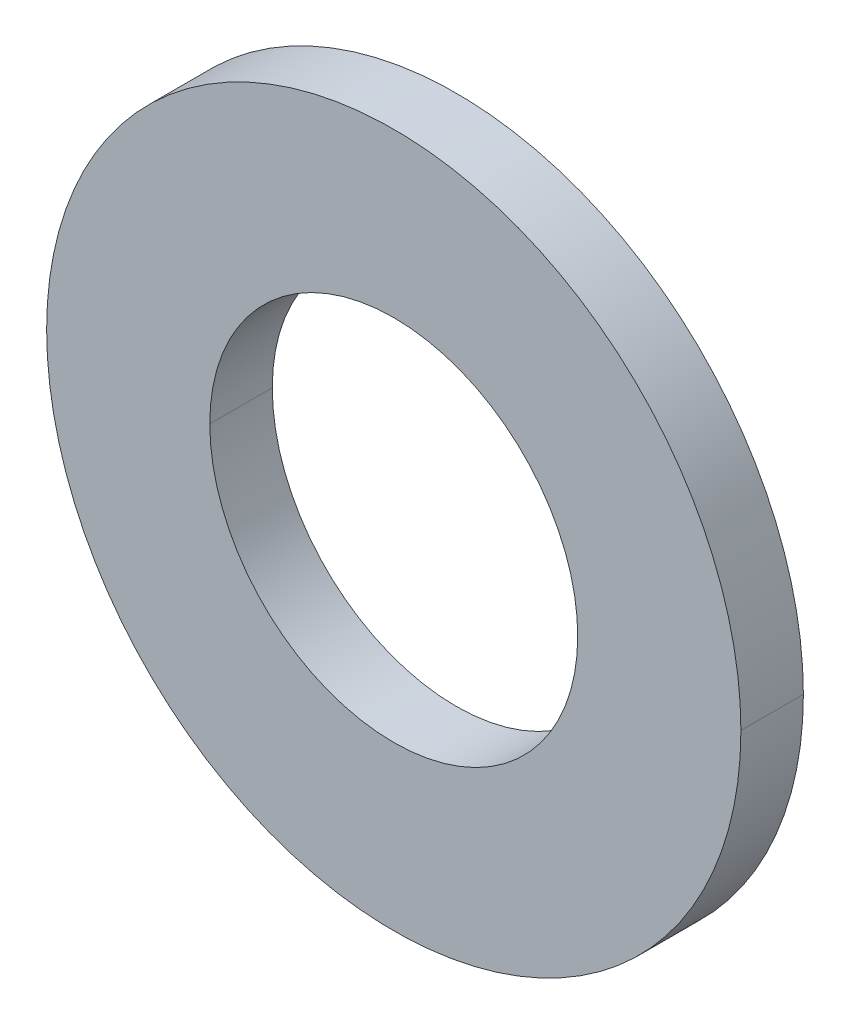
ISO-10303-21;
HEADER;
FILE_DESCRIPTION(('STEP AP214'),'2;1');
FILE_NAME('part.step','',(''),(''),'','','');
FILE_SCHEMA(('AUTOMOTIVE_DESIGN { 1 0 10303 214 1 1 1 1 }'));
ENDSEC;
DATA;
#1=APPLICATION_CONTEXT('core data for automotive mechanical design processes');
#2=APPLICATION_PROTOCOL_DEFINITION('international standard','automotive_design',2000,#1);
#3=PRODUCT_CONTEXT('',#1,'mechanical');
#4=PRODUCT('Part','Part','',(#3));
#5=PRODUCT_RELATED_PRODUCT_CATEGORY('part','',(#4));
#6=PRODUCT_DEFINITION_FORMATION('','',#4);
#7=PRODUCT_DEFINITION_CONTEXT('part definition',#1,'design');
#8=PRODUCT_DEFINITION('design','',#6,#7);
#9=PRODUCT_DEFINITION_SHAPE('','',#8);
#10=(LENGTH_UNIT() NAMED_UNIT(*) SI_UNIT(.MILLI.,.METRE.));
#11=(NAMED_UNIT(*) PLANE_ANGLE_UNIT() SI_UNIT($,.RADIAN.));
#12=(NAMED_UNIT(*) SI_UNIT($,.STERADIAN.) SOLID_ANGLE_UNIT());
#13=UNCERTAINTY_MEASURE_WITH_UNIT(LENGTH_MEASURE(1.E-05),#10,'distance_accuracy_value','');
#14=(GEOMETRIC_REPRESENTATION_CONTEXT(3) GLOBAL_UNCERTAINTY_ASSIGNED_CONTEXT((#13)) GLOBAL_UNIT_ASSIGNED_CONTEXT((#10,
#11,#12)) REPRESENTATION_CONTEXT('',''));
#15=CARTESIAN_POINT('',(0.,0.,0.));
#16=DIRECTION('',(0.,0.,1.));
#17=DIRECTION('',(1.,0.,0.));
#18=AXIS2_PLACEMENT_3D('',#15,#16,#17);
#19=CARTESIAN_POINT('',(0.,0.,0.45));
#20=DIRECTION('',(0.,0.,1.));
#21=DIRECTION('',(0.,-1.,0.));
#22=AXIS2_PLACEMENT_3D('',#19,#20,#21);
#23=CYLINDRICAL_SURFACE('',#22,2.65);
#24=CARTESIAN_POINT('',(0.,0.,0.45));
#25=DIRECTION('',(0.,0.,1.));
#26=DIRECTION('',(1.,0.,0.));
#27=AXIS2_PLACEMENT_3D('',#24,#25,#26);
#28=CIRCLE('',#27,2.65);
#29=CARTESIAN_POINT('',(2.65,0.,0.45));
#30=VERTEX_POINT('',#29);
#31=CARTESIAN_POINT('',(-2.65,0.,0.45));
#32=VERTEX_POINT('',#31);
#33=EDGE_CURVE('E11',#30,#32,#28,.T.);
#34=ORIENTED_EDGE('',*,*,#33,.T.);
#35=DIRECTION('',(0.,0.,1.));
#36=VECTOR('',#35,1.);
#37=CARTESIAN_POINT('',(-2.65,0.,-0.45));
#38=LINE('',#37,#36);
#39=CARTESIAN_POINT('',(-2.65,0.,-0.45));
#40=VERTEX_POINT('',#39);
#41=EDGE_CURVE('E25',#40,#32,#38,.T.);
#42=ORIENTED_EDGE('',*,*,#41,.F.);
#43=CARTESIAN_POINT('',(0.,0.,-0.45));
#44=DIRECTION('',(0.,0.,1.));
#45=DIRECTION('',(1.,0.,0.));
#46=AXIS2_PLACEMENT_3D('',#43,#44,#45);
#47=CIRCLE('',#46,2.65);
#48=CARTESIAN_POINT('',(2.65,0.,-0.45));
#49=VERTEX_POINT('',#48);
#50=EDGE_CURVE('E97',#49,#40,#47,.T.);
#51=ORIENTED_EDGE('',*,*,#50,.F.);
#52=DIRECTION('',(0.,0.,1.));
#53=VECTOR('',#52,1.);
#54=CARTESIAN_POINT('',(2.65,0.,-0.45));
#55=LINE('',#54,#53);
#56=EDGE_CURVE('E93',#49,#30,#55,.T.);
#57=ORIENTED_EDGE('',*,*,#56,.T.);
#58=EDGE_LOOP('',(#34,#42,#51,#57));
#59=FACE_BOUND('',#58,.T.);
#60=ADVANCED_FACE('F17',(#59),#23,.F.);
#61=CARTESIAN_POINT('',(0.,0.,0.45));
#62=DIRECTION('',(0.,0.,1.));
#63=DIRECTION('',(0.,1.,0.));
#64=AXIS2_PLACEMENT_3D('',#61,#62,#63);
#65=CYLINDRICAL_SURFACE('',#64,2.65);
#66=CARTESIAN_POINT('',(0.,0.,-0.45));
#67=DIRECTION('',(0.,0.,1.));
#68=DIRECTION('',(1.,0.,0.));
#69=AXIS2_PLACEMENT_3D('',#66,#67,#68);
#70=CIRCLE('',#69,2.65);
#71=EDGE_CURVE('E88',#40,#49,#70,.T.);
#72=ORIENTED_EDGE('',*,*,#71,.F.);
#73=ORIENTED_EDGE('',*,*,#41,.T.);
#74=CARTESIAN_POINT('',(0.,0.,0.45));
#75=DIRECTION('',(0.,0.,1.));
#76=DIRECTION('',(1.,0.,0.));
#77=AXIS2_PLACEMENT_3D('',#74,#75,#76);
#78=CIRCLE('',#77,2.65);
#79=EDGE_CURVE('E83',#32,#30,#78,.T.);
#80=ORIENTED_EDGE('',*,*,#79,.T.);
#81=ORIENTED_EDGE('',*,*,#56,.F.);
#82=EDGE_LOOP('',(#72,#73,#80,#81));
#83=FACE_BOUND('',#82,.T.);
#84=ADVANCED_FACE('F108',(#83),#65,.F.);
#85=CARTESIAN_POINT('',(0.,0.,0.45));
#86=DIRECTION('',(0.,0.,1.));
#87=DIRECTION('',(1.,0.,0.));
#88=AXIS2_PLACEMENT_3D('',#85,#86,#87);
#89=PLANE('',#88);
#90=ORIENTED_EDGE('',*,*,#33,.F.);
#91=ORIENTED_EDGE('',*,*,#79,.F.);
#92=EDGE_LOOP('',(#90,#91));
#93=FACE_BOUND('',#92,.T.);
#94=CARTESIAN_POINT('',(0.,0.,0.45));
#95=DIRECTION('',(0.,0.,1.));
#96=DIRECTION('',(1.,0.,0.));
#97=AXIS2_PLACEMENT_3D('',#94,#95,#96);
#98=CIRCLE('',#97,5.);
#99=CARTESIAN_POINT('',(5.,0.,0.45));
#100=VERTEX_POINT('',#99);
#101=CARTESIAN_POINT('',(-5.,0.,0.45));
#102=VERTEX_POINT('',#101);
#103=EDGE_CURVE('E72',#100,#102,#98,.T.);
#104=ORIENTED_EDGE('',*,*,#103,.T.);
#105=CARTESIAN_POINT('',(0.,0.,0.45));
#106=DIRECTION('',(0.,0.,1.));
#107=DIRECTION('',(1.,0.,0.));
#108=AXIS2_PLACEMENT_3D('',#105,#106,#107);
#109=CIRCLE('',#108,5.);
#110=EDGE_CURVE('E60',#102,#100,#109,.T.);
#111=ORIENTED_EDGE('',*,*,#110,.T.);
#112=EDGE_LOOP('',(#104,#111));
#113=FACE_BOUND('',#112,.T.);
#114=ADVANCED_FACE('F111',(#93,#113),#89,.T.);
#115=CARTESIAN_POINT('',(0.,0.,0.45));
#116=DIRECTION('',(0.,0.,1.));
#117=DIRECTION('',(0.,1.,0.));
#118=AXIS2_PLACEMENT_3D('',#115,#116,#117);
#119=CYLINDRICAL_SURFACE('',#118,5.);
#120=CARTESIAN_POINT('',(0.,0.,-0.45));
#121=DIRECTION('',(0.,0.,1.));
#122=DIRECTION('',(1.,0.,0.));
#123=AXIS2_PLACEMENT_3D('',#120,#121,#122);
#124=CIRCLE('',#123,5.);
#125=CARTESIAN_POINT('',(-5.,0.,-0.45));
#126=VERTEX_POINT('',#125);
#127=CARTESIAN_POINT('',(5.,0.,-0.45));
#128=VERTEX_POINT('',#127);
#129=EDGE_CURVE('E58',#126,#128,#124,.T.);
#130=ORIENTED_EDGE('',*,*,#129,.T.);
#131=DIRECTION('',(0.,0.,1.));
#132=VECTOR('',#131,1.);
#133=CARTESIAN_POINT('',(5.,0.,-0.45));
#134=LINE('',#133,#132);
#135=EDGE_CURVE('E63',#128,#100,#134,.T.);
#136=ORIENTED_EDGE('',*,*,#135,.T.);
#137=ORIENTED_EDGE('',*,*,#110,.F.);
#138=DIRECTION('',(0.,0.,1.));
#139=VECTOR('',#138,1.);
#140=CARTESIAN_POINT('',(-5.,0.,-0.45));
#141=LINE('',#140,#139);
#142=EDGE_CURVE('E53',#126,#102,#141,.T.);
#143=ORIENTED_EDGE('',*,*,#142,.F.);
#144=EDGE_LOOP('',(#130,#136,#137,#143));
#145=FACE_BOUND('',#144,.T.);
#146=ADVANCED_FACE('F55',(#145),#119,.T.);
#147=CARTESIAN_POINT('',(0.,0.,0.45));
#148=DIRECTION('',(0.,0.,1.));
#149=DIRECTION('',(0.,-1.,0.));
#150=AXIS2_PLACEMENT_3D('',#147,#148,#149);
#151=CYLINDRICAL_SURFACE('',#150,5.);
#152=ORIENTED_EDGE('',*,*,#103,.F.);
#153=ORIENTED_EDGE('',*,*,#135,.F.);
#154=CARTESIAN_POINT('',(0.,0.,-0.45));
#155=DIRECTION('',(0.,0.,1.));
#156=DIRECTION('',(1.,0.,0.));
#157=AXIS2_PLACEMENT_3D('',#154,#155,#156);
#158=CIRCLE('',#157,5.);
#159=EDGE_CURVE('E64',#128,#126,#158,.T.);
#160=ORIENTED_EDGE('',*,*,#159,.T.);
#161=ORIENTED_EDGE('',*,*,#142,.T.);
#162=EDGE_LOOP('',(#152,#153,#160,#161));
#163=FACE_BOUND('',#162,.T.);
#164=ADVANCED_FACE('F67',(#163),#151,.T.);
#165=CARTESIAN_POINT('',(0.,0.,-0.45));
#166=DIRECTION('',(0.,0.,1.));
#167=DIRECTION('',(1.,0.,0.));
#168=AXIS2_PLACEMENT_3D('',#165,#166,#167);
#169=PLANE('',#168);
#170=ORIENTED_EDGE('',*,*,#50,.T.);
#171=ORIENTED_EDGE('',*,*,#71,.T.);
#172=EDGE_LOOP('',(#170,#171));
#173=FACE_BOUND('',#172,.T.);
#174=ORIENTED_EDGE('',*,*,#159,.F.);
#175=ORIENTED_EDGE('',*,*,#129,.F.);
#176=EDGE_LOOP('',(#174,#175));
#177=FACE_BOUND('',#176,.T.);
#178=ADVANCED_FACE('F70',(#173,#177),#169,.F.);
#179=CLOSED_SHELL('',(#60,#84,#114,#146,#164,#178));
#180=MANIFOLD_SOLID_BREP('B1',#179);
#181=ADVANCED_BREP_SHAPE_REPRESENTATION('',(#18,#180),#14);
#182=SHAPE_DEFINITION_REPRESENTATION(#9,#181);
ENDSEC;
END-ISO-10303-21;
